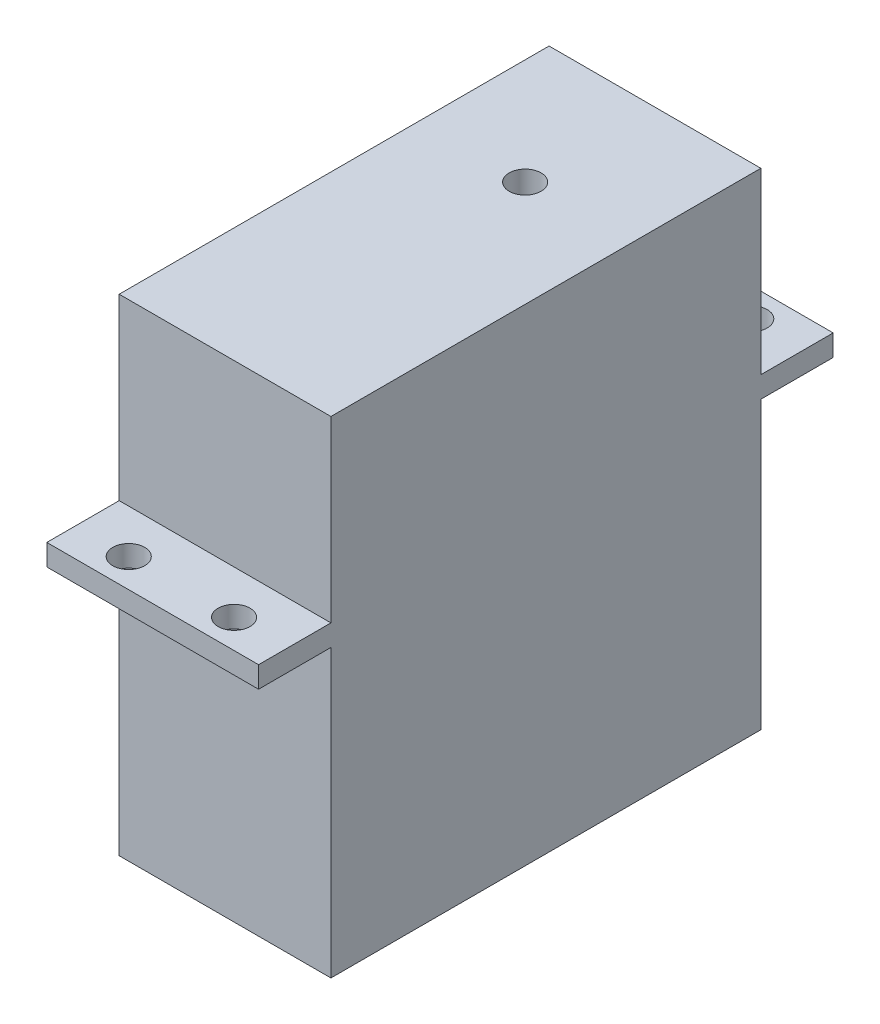
ISO-10303-21;
HEADER;
FILE_DESCRIPTION(('STEP AP214'),'2;1');
FILE_NAME('part.step','',(''),(''),'','','');
FILE_SCHEMA(('AUTOMOTIVE_DESIGN { 1 0 10303 214 1 1 1 1 }'));
ENDSEC;
DATA;
#1=APPLICATION_CONTEXT('core data for automotive mechanical design processes');
#2=APPLICATION_PROTOCOL_DEFINITION('international standard','automotive_design',2000,#1);
#3=PRODUCT_CONTEXT('',#1,'mechanical');
#4=PRODUCT('Part','Part','',(#3));
#5=PRODUCT_RELATED_PRODUCT_CATEGORY('part','',(#4));
#6=PRODUCT_DEFINITION_FORMATION('','',#4);
#7=PRODUCT_DEFINITION_CONTEXT('part definition',#1,'design');
#8=PRODUCT_DEFINITION('design','',#6,#7);
#9=PRODUCT_DEFINITION_SHAPE('','',#8);
#10=(LENGTH_UNIT() NAMED_UNIT(*) SI_UNIT(.MILLI.,.METRE.));
#11=(NAMED_UNIT(*) PLANE_ANGLE_UNIT() SI_UNIT($,.RADIAN.));
#12=(NAMED_UNIT(*) SI_UNIT($,.STERADIAN.) SOLID_ANGLE_UNIT());
#13=UNCERTAINTY_MEASURE_WITH_UNIT(LENGTH_MEASURE(1.E-05),#10,'distance_accuracy_value','');
#14=(GEOMETRIC_REPRESENTATION_CONTEXT(3) GLOBAL_UNCERTAINTY_ASSIGNED_CONTEXT((#13)) GLOBAL_UNIT_ASSIGNED_CONTEXT((#10,
#11,#12)) REPRESENTATION_CONTEXT('',''));
#15=CARTESIAN_POINT('',(0.,0.,0.));
#16=DIRECTION('',(0.,0.,1.));
#17=DIRECTION('',(1.,0.,0.));
#18=AXIS2_PLACEMENT_3D('',#15,#16,#17);
#19=CARTESIAN_POINT('',(-9.95,45.7,-20.2));
#20=DIRECTION('',(0.,0.,1.));
#21=DIRECTION('',(1.,0.,0.));
#22=AXIS2_PLACEMENT_3D('',#19,#20,#21);
#23=PLANE('',#22);
#24=DIRECTION('',(-1.,0.,0.));
#25=VECTOR('',#24,1.);
#26=CARTESIAN_POINT('',(-9.95,26.9,-20.2));
#27=LINE('',#26,#25);
#28=CARTESIAN_POINT('',(9.95,26.9,-20.2));
#29=VERTEX_POINT('',#28);
#30=CARTESIAN_POINT('',(-9.95,26.9,-20.2));
#31=VERTEX_POINT('',#30);
#32=EDGE_CURVE('E51',#29,#31,#27,.T.);
#33=ORIENTED_EDGE('',*,*,#32,.F.);
#34=DIRECTION('',(0.,-1.,0.));
#35=VECTOR('',#34,1.);
#36=CARTESIAN_POINT('',(9.95,45.7,-20.2));
#37=LINE('',#36,#35);
#38=CARTESIAN_POINT('',(9.95,0.,-20.2));
#39=VERTEX_POINT('',#38);
#40=EDGE_CURVE('E185',#29,#39,#37,.T.);
#41=ORIENTED_EDGE('',*,*,#40,.T.);
#42=DIRECTION('',(-1.,0.,0.));
#43=VECTOR('',#42,1.);
#44=CARTESIAN_POINT('',(-9.95,0.,-20.2));
#45=LINE('',#44,#43);
#46=CARTESIAN_POINT('',(-9.95,0.,-20.2));
#47=VERTEX_POINT('',#46);
#48=EDGE_CURVE('E172',#39,#47,#45,.T.);
#49=ORIENTED_EDGE('',*,*,#48,.T.);
#50=DIRECTION('',(0.,-1.,0.));
#51=VECTOR('',#50,1.);
#52=CARTESIAN_POINT('',(-9.95,45.7,-20.2));
#53=LINE('',#52,#51);
#54=EDGE_CURVE('E56',#31,#47,#53,.T.);
#55=ORIENTED_EDGE('',*,*,#54,.F.);
#56=EDGE_LOOP('',(#33,#41,#49,#55));
#57=FACE_BOUND('',#56,.T.);
#58=ADVANCED_FACE('F34',(#57),#23,.F.);
#59=DIRECTION('',(1.,0.,0.));
#60=VECTOR('',#59,1.);
#61=CARTESIAN_POINT('',(-9.95,28.9,-20.2));
#62=LINE('',#61,#60);
#63=CARTESIAN_POINT('',(-9.95,28.9,-20.2));
#64=VERTEX_POINT('',#63);
#65=CARTESIAN_POINT('',(9.94999999999999,28.9,-20.2));
#66=VERTEX_POINT('',#65);
#67=EDGE_CURVE('E149',#64,#66,#62,.T.);
#68=ORIENTED_EDGE('',*,*,#67,.F.);
#69=CARTESIAN_POINT('',(-9.95,45.7,-20.2));
#70=VERTEX_POINT('',#69);
#71=EDGE_CURVE('E183',#70,#64,#53,.T.);
#72=ORIENTED_EDGE('',*,*,#71,.F.);
#73=DIRECTION('',(-1.,0.,0.));
#74=VECTOR('',#73,1.);
#75=CARTESIAN_POINT('',(-9.95,45.7,-20.2));
#76=LINE('',#75,#74);
#77=CARTESIAN_POINT('',(9.95,45.7,-20.2));
#78=VERTEX_POINT('',#77);
#79=EDGE_CURVE('E162',#78,#70,#76,.T.);
#80=ORIENTED_EDGE('',*,*,#79,.F.);
#81=EDGE_CURVE('E186',#78,#66,#37,.T.);
#82=ORIENTED_EDGE('',*,*,#81,.T.);
#83=EDGE_LOOP('',(#68,#72,#80,#82));
#84=FACE_BOUND('',#83,.T.);
#85=ADVANCED_FACE('F250',(#84),#23,.F.);
#86=CARTESIAN_POINT('',(-9.94999999999999,45.7,20.2));
#87=DIRECTION('',(0.,0.,-1.));
#88=DIRECTION('',(-1.,0.,0.));
#89=AXIS2_PLACEMENT_3D('',#86,#87,#88);
#90=PLANE('',#89);
#91=DIRECTION('',(1.,0.,0.));
#92=VECTOR('',#91,1.);
#93=CARTESIAN_POINT('',(-9.94999999999999,26.9,20.2));
#94=LINE('',#93,#92);
#95=CARTESIAN_POINT('',(-9.94999999999999,26.9,20.2));
#96=VERTEX_POINT('',#95);
#97=CARTESIAN_POINT('',(9.95,26.9,20.2));
#98=VERTEX_POINT('',#97);
#99=EDGE_CURVE('E11',#96,#98,#94,.T.);
#100=ORIENTED_EDGE('',*,*,#99,.F.);
#101=DIRECTION('',(0.,-1.,0.));
#102=VECTOR('',#101,1.);
#103=CARTESIAN_POINT('',(-9.94999999999999,45.7,20.2));
#104=LINE('',#103,#102);
#105=CARTESIAN_POINT('',(-9.94999999999999,0.,20.2));
#106=VERTEX_POINT('',#105);
#107=EDGE_CURVE('E148',#96,#106,#104,.T.);
#108=ORIENTED_EDGE('',*,*,#107,.T.);
#109=DIRECTION('',(1.,0.,0.));
#110=VECTOR('',#109,1.);
#111=CARTESIAN_POINT('',(-9.94999999999999,0.,20.2));
#112=LINE('',#111,#110);
#113=CARTESIAN_POINT('',(9.95,0.,20.2));
#114=VERTEX_POINT('',#113);
#115=EDGE_CURVE('E163',#106,#114,#112,.T.);
#116=ORIENTED_EDGE('',*,*,#115,.T.);
#117=DIRECTION('',(0.,-1.,0.));
#118=VECTOR('',#117,1.);
#119=CARTESIAN_POINT('',(9.95,45.7,20.2));
#120=LINE('',#119,#118);
#121=EDGE_CURVE('E169',#98,#114,#120,.T.);
#122=ORIENTED_EDGE('',*,*,#121,.F.);
#123=EDGE_LOOP('',(#100,#108,#116,#122));
#124=FACE_BOUND('',#123,.T.);
#125=ADVANCED_FACE('F280',(#124),#90,.F.);
#126=DIRECTION('',(-1.,0.,0.));
#127=VECTOR('',#126,1.);
#128=CARTESIAN_POINT('',(-9.94999999999999,28.9,20.2));
#129=LINE('',#128,#127);
#130=CARTESIAN_POINT('',(9.95,28.9,20.2));
#131=VERTEX_POINT('',#130);
#132=CARTESIAN_POINT('',(-9.94999999999999,28.9,20.2));
#133=VERTEX_POINT('',#132);
#134=EDGE_CURVE('E43',#131,#133,#129,.T.);
#135=ORIENTED_EDGE('',*,*,#134,.F.);
#136=CARTESIAN_POINT('',(9.95,45.7,20.2));
#137=VERTEX_POINT('',#136);
#138=EDGE_CURVE('E178',#137,#131,#120,.T.);
#139=ORIENTED_EDGE('',*,*,#138,.F.);
#140=DIRECTION('',(1.,0.,0.));
#141=VECTOR('',#140,1.);
#142=CARTESIAN_POINT('',(-9.94999999999999,45.7,20.2));
#143=LINE('',#142,#141);
#144=CARTESIAN_POINT('',(-9.94999999999999,45.7,20.2));
#145=VERTEX_POINT('',#144);
#146=EDGE_CURVE('E167',#145,#137,#143,.T.);
#147=ORIENTED_EDGE('',*,*,#146,.F.);
#148=EDGE_CURVE('E181',#145,#133,#104,.T.);
#149=ORIENTED_EDGE('',*,*,#148,.T.);
#150=EDGE_LOOP('',(#135,#139,#147,#149));
#151=FACE_BOUND('',#150,.T.);
#152=ADVANCED_FACE('F257',(#151),#90,.F.);
#153=CARTESIAN_POINT('',(9.95,45.7,-20.2));
#154=DIRECTION('',(-1.,0.,0.));
#155=DIRECTION('',(0.,0.,1.));
#156=AXIS2_PLACEMENT_3D('',#153,#154,#155);
#157=PLANE('',#156);
#158=DIRECTION('',(0.,0.,-1.));
#159=VECTOR('',#158,1.);
#160=CARTESIAN_POINT('',(9.94999999999999,28.9,27.));
#161=LINE('',#160,#159);
#162=CARTESIAN_POINT('',(9.94999999999999,28.9,-27.));
#163=VERTEX_POINT('',#162);
#164=EDGE_CURVE('E226',#66,#163,#161,.T.);
#165=ORIENTED_EDGE('',*,*,#164,.F.);
#166=ORIENTED_EDGE('',*,*,#81,.F.);
#167=DIRECTION('',(0.,0.,-1.));
#168=VECTOR('',#167,1.);
#169=CARTESIAN_POINT('',(9.95,45.7,-20.2));
#170=LINE('',#169,#168);
#171=EDGE_CURVE('E159',#137,#78,#170,.T.);
#172=ORIENTED_EDGE('',*,*,#171,.F.);
#173=ORIENTED_EDGE('',*,*,#138,.T.);
#174=CARTESIAN_POINT('',(9.94999999999999,28.9,27.));
#175=VERTEX_POINT('',#174);
#176=EDGE_CURVE('E227',#175,#131,#161,.T.);
#177=ORIENTED_EDGE('',*,*,#176,.F.);
#178=DIRECTION('',(0.,1.,0.));
#179=VECTOR('',#178,1.);
#180=CARTESIAN_POINT('',(9.94999999999999,28.9,27.));
#181=LINE('',#180,#179);
#182=CARTESIAN_POINT('',(9.94999999999999,26.9,27.));
#183=VERTEX_POINT('',#182);
#184=EDGE_CURVE('E132',#183,#175,#181,.T.);
#185=ORIENTED_EDGE('',*,*,#184,.F.);
#186=DIRECTION('',(0.,0.,-1.));
#187=VECTOR('',#186,1.);
#188=CARTESIAN_POINT('',(9.94999999999999,26.9,27.));
#189=LINE('',#188,#187);
#190=EDGE_CURVE('E129',#183,#98,#189,.T.);
#191=ORIENTED_EDGE('',*,*,#190,.T.);
#192=ORIENTED_EDGE('',*,*,#121,.T.);
#193=DIRECTION('',(0.,0.,-1.));
#194=VECTOR('',#193,1.);
#195=CARTESIAN_POINT('',(9.95,0.,-20.2));
#196=LINE('',#195,#194);
#197=EDGE_CURVE('E158',#114,#39,#196,.T.);
#198=ORIENTED_EDGE('',*,*,#197,.T.);
#199=ORIENTED_EDGE('',*,*,#40,.F.);
#200=CARTESIAN_POINT('',(9.94999999999999,26.9,-27.));
#201=VERTEX_POINT('',#200);
#202=EDGE_CURVE('E229',#29,#201,#189,.T.);
#203=ORIENTED_EDGE('',*,*,#202,.T.);
#204=DIRECTION('',(0.,1.,0.));
#205=VECTOR('',#204,1.);
#206=CARTESIAN_POINT('',(9.94999999999999,28.9,-27.));
#207=LINE('',#206,#205);
#208=EDGE_CURVE('E220',#201,#163,#207,.T.);
#209=ORIENTED_EDGE('',*,*,#208,.T.);
#210=EDGE_LOOP('',(#165,#166,#172,#173,#177,#185,#191,#192,#198,#199,#203,#209));
#211=FACE_BOUND('',#210,.T.);
#212=ADVANCED_FACE('F36',(#211),#157,.F.);
#213=CARTESIAN_POINT('',(-9.95,45.7,-20.2));
#214=DIRECTION('',(1.,0.,0.));
#215=DIRECTION('',(0.,0.,-1.));
#216=AXIS2_PLACEMENT_3D('',#213,#214,#215);
#217=PLANE('',#216);
#218=ORIENTED_EDGE('',*,*,#71,.T.);
#219=DIRECTION('',(0.,0.,-1.));
#220=VECTOR('',#219,1.);
#221=CARTESIAN_POINT('',(-9.94999999999999,28.9,27.));
#222=LINE('',#221,#220);
#223=CARTESIAN_POINT('',(-9.94999999999999,28.9,-27.));
#224=VERTEX_POINT('',#223);
#225=EDGE_CURVE('E214',#64,#224,#222,.T.);
#226=ORIENTED_EDGE('',*,*,#225,.T.);
#227=DIRECTION('',(0.,-1.,0.));
#228=VECTOR('',#227,1.);
#229=CARTESIAN_POINT('',(-9.94999999999999,28.9,-27.));
#230=LINE('',#229,#228);
#231=CARTESIAN_POINT('',(-9.94999999999999,26.9,-27.));
#232=VERTEX_POINT('',#231);
#233=EDGE_CURVE('E209',#224,#232,#230,.T.);
#234=ORIENTED_EDGE('',*,*,#233,.T.);
#235=DIRECTION('',(0.,0.,-1.));
#236=VECTOR('',#235,1.);
#237=CARTESIAN_POINT('',(-9.94999999999999,26.9,27.));
#238=LINE('',#237,#236);
#239=EDGE_CURVE('E150',#31,#232,#238,.T.);
#240=ORIENTED_EDGE('',*,*,#239,.F.);
#241=ORIENTED_EDGE('',*,*,#54,.T.);
#242=DIRECTION('',(0.,0.,1.));
#243=VECTOR('',#242,1.);
#244=CARTESIAN_POINT('',(-9.95,0.,-20.2));
#245=LINE('',#244,#243);
#246=EDGE_CURVE('E174',#47,#106,#245,.T.);
#247=ORIENTED_EDGE('',*,*,#246,.T.);
#248=ORIENTED_EDGE('',*,*,#107,.F.);
#249=CARTESIAN_POINT('',(-9.94999999999999,26.9,27.));
#250=VERTEX_POINT('',#249);
#251=EDGE_CURVE('E127',#250,#96,#238,.T.);
#252=ORIENTED_EDGE('',*,*,#251,.F.);
#253=DIRECTION('',(0.,-1.,0.));
#254=VECTOR('',#253,1.);
#255=CARTESIAN_POINT('',(-9.94999999999999,28.9,27.));
#256=LINE('',#255,#254);
#257=CARTESIAN_POINT('',(-9.94999999999999,28.9,27.));
#258=VERTEX_POINT('',#257);
#259=EDGE_CURVE('E133',#258,#250,#256,.T.);
#260=ORIENTED_EDGE('',*,*,#259,.F.);
#261=EDGE_CURVE('E225',#258,#133,#222,.T.);
#262=ORIENTED_EDGE('',*,*,#261,.T.);
#263=ORIENTED_EDGE('',*,*,#148,.F.);
#264=DIRECTION('',(0.,0.,1.));
#265=VECTOR('',#264,1.);
#266=CARTESIAN_POINT('',(-9.95,45.7,-20.2));
#267=LINE('',#266,#265);
#268=EDGE_CURVE('E165',#70,#145,#267,.T.);
#269=ORIENTED_EDGE('',*,*,#268,.F.);
#270=EDGE_LOOP('',(#218,#226,#234,#240,#241,#247,#248,#252,#260,#262,#263,#269));
#271=FACE_BOUND('',#270,.T.);
#272=ADVANCED_FACE('F146',(#271),#217,.F.);
#273=CARTESIAN_POINT('',(0.,45.7,0.));
#274=DIRECTION('',(0.,1.,0.));
#275=DIRECTION('',(0.,0.,1.));
#276=AXIS2_PLACEMENT_3D('',#273,#274,#275);
#277=PLANE('',#276);
#278=CARTESIAN_POINT('',(0.,45.7,-8.00000000000001));
#279=DIRECTION('',(0.,1.,0.));
#280=DIRECTION('',(0.,0.,1.));
#281=AXIS2_PLACEMENT_3D('',#278,#279,#280);
#282=CIRCLE('',#281,1.5);
#283=CARTESIAN_POINT('',(0.,45.7,-6.50000000000001));
#284=VERTEX_POINT('',#283);
#285=EDGE_CURVE('E195',#284,#284,#282,.T.);
#286=ORIENTED_EDGE('',*,*,#285,.F.);
#287=EDGE_LOOP('',(#286));
#288=FACE_BOUND('',#287,.T.);
#289=ORIENTED_EDGE('',*,*,#171,.T.);
#290=ORIENTED_EDGE('',*,*,#79,.T.);
#291=ORIENTED_EDGE('',*,*,#268,.T.);
#292=ORIENTED_EDGE('',*,*,#146,.T.);
#293=EDGE_LOOP('',(#289,#290,#291,#292));
#294=FACE_BOUND('',#293,.T.);
#295=ADVANCED_FACE('F254',(#288,#294),#277,.T.);
#296=CARTESIAN_POINT('',(0.,0.,0.));
#297=DIRECTION('',(0.,1.,0.));
#298=DIRECTION('',(0.,0.,1.));
#299=AXIS2_PLACEMENT_3D('',#296,#297,#298);
#300=PLANE('',#299);
#301=ORIENTED_EDGE('',*,*,#197,.F.);
#302=ORIENTED_EDGE('',*,*,#115,.F.);
#303=ORIENTED_EDGE('',*,*,#246,.F.);
#304=ORIENTED_EDGE('',*,*,#48,.F.);
#305=EDGE_LOOP('',(#301,#302,#303,#304));
#306=FACE_BOUND('',#305,.T.);
#307=ADVANCED_FACE('F269',(#306),#300,.F.);
#308=CARTESIAN_POINT('',(0.,0.,27.));
#309=DIRECTION('',(0.,0.,1.));
#310=DIRECTION('',(1.,0.,0.));
#311=AXIS2_PLACEMENT_3D('',#308,#309,#310);
#312=PLANE('',#311);
#313=ORIENTED_EDGE('',*,*,#259,.T.);
#314=DIRECTION('',(1.,0.,0.));
#315=VECTOR('',#314,1.);
#316=CARTESIAN_POINT('',(-9.94999999999999,26.9,27.));
#317=LINE('',#316,#315);
#318=EDGE_CURVE('E123',#250,#183,#317,.T.);
#319=ORIENTED_EDGE('',*,*,#318,.T.);
#320=ORIENTED_EDGE('',*,*,#184,.T.);
#321=DIRECTION('',(-1.,0.,0.));
#322=VECTOR('',#321,1.);
#323=CARTESIAN_POINT('',(-9.94999999999999,28.9,27.));
#324=LINE('',#323,#322);
#325=EDGE_CURVE('E138',#175,#258,#324,.T.);
#326=ORIENTED_EDGE('',*,*,#325,.T.);
#327=EDGE_LOOP('',(#313,#319,#320,#326));
#328=FACE_BOUND('',#327,.T.);
#329=ADVANCED_FACE('F136',(#328),#312,.T.);
#330=CARTESIAN_POINT('',(-9.94999999999999,28.9,27.));
#331=DIRECTION('',(0.,-1.,0.));
#332=DIRECTION('',(0.,0.,-1.));
#333=AXIS2_PLACEMENT_3D('',#330,#331,#332);
#334=PLANE('',#333);
#335=CARTESIAN_POINT('',(-4.95,28.9,24.3));
#336=DIRECTION('',(0.,1.,0.));
#337=DIRECTION('',(0.,0.,1.));
#338=AXIS2_PLACEMENT_3D('',#335,#336,#337);
#339=CIRCLE('',#338,1.5);
#340=CARTESIAN_POINT('',(-4.95,28.9,25.8));
#341=VERTEX_POINT('',#340);
#342=EDGE_CURVE('E388',#341,#341,#339,.T.);
#343=ORIENTED_EDGE('',*,*,#342,.F.);
#344=EDGE_LOOP('',(#343));
#345=FACE_BOUND('',#344,.T.);
#346=CARTESIAN_POINT('',(4.95,28.9,24.3));
#347=DIRECTION('',(0.,1.,0.));
#348=DIRECTION('',(0.,0.,1.));
#349=AXIS2_PLACEMENT_3D('',#346,#347,#348);
#350=CIRCLE('',#349,1.5);
#351=CARTESIAN_POINT('',(4.95,28.9,25.8));
#352=VERTEX_POINT('',#351);
#353=EDGE_CURVE('E391',#352,#352,#350,.T.);
#354=ORIENTED_EDGE('',*,*,#353,.F.);
#355=EDGE_LOOP('',(#354));
#356=FACE_BOUND('',#355,.T.);
#357=ORIENTED_EDGE('',*,*,#176,.T.);
#358=ORIENTED_EDGE('',*,*,#134,.T.);
#359=ORIENTED_EDGE('',*,*,#261,.F.);
#360=ORIENTED_EDGE('',*,*,#325,.F.);
#361=EDGE_LOOP('',(#357,#358,#359,#360));
#362=FACE_BOUND('',#361,.T.);
#363=ADVANCED_FACE('F258',(#345,#356,#362),#334,.F.);
#364=CARTESIAN_POINT('',(-9.94999999999999,26.9,27.));
#365=DIRECTION('',(0.,1.,0.));
#366=DIRECTION('',(0.,0.,1.));
#367=AXIS2_PLACEMENT_3D('',#364,#365,#366);
#368=PLANE('',#367);
#369=CARTESIAN_POINT('',(-4.95,26.9,24.3));
#370=DIRECTION('',(0.,1.,0.));
#371=DIRECTION('',(0.,0.,1.));
#372=AXIS2_PLACEMENT_3D('',#369,#370,#371);
#373=CIRCLE('',#372,1.5);
#374=CARTESIAN_POINT('',(-4.95,26.9,25.8));
#375=VERTEX_POINT('',#374);
#376=EDGE_CURVE('E38',#375,#375,#373,.T.);
#377=ORIENTED_EDGE('',*,*,#376,.T.);
#378=EDGE_LOOP('',(#377));
#379=FACE_BOUND('',#378,.T.);
#380=CARTESIAN_POINT('',(4.95,26.9,24.3));
#381=DIRECTION('',(0.,1.,0.));
#382=DIRECTION('',(0.,0.,1.));
#383=AXIS2_PLACEMENT_3D('',#380,#381,#382);
#384=CIRCLE('',#383,1.5);
#385=CARTESIAN_POINT('',(4.95,26.9,25.8));
#386=VERTEX_POINT('',#385);
#387=EDGE_CURVE('E189',#386,#386,#384,.T.);
#388=ORIENTED_EDGE('',*,*,#387,.T.);
#389=EDGE_LOOP('',(#388));
#390=FACE_BOUND('',#389,.T.);
#391=ORIENTED_EDGE('',*,*,#251,.T.);
#392=ORIENTED_EDGE('',*,*,#99,.T.);
#393=ORIENTED_EDGE('',*,*,#190,.F.);
#394=ORIENTED_EDGE('',*,*,#318,.F.);
#395=EDGE_LOOP('',(#391,#392,#393,#394));
#396=FACE_BOUND('',#395,.T.);
#397=ADVANCED_FACE('F125',(#379,#390,#396),#368,.F.);
#398=CARTESIAN_POINT('',(4.95,26.9,-24.3));
#399=DIRECTION('',(0.,1.,0.));
#400=DIRECTION('',(0.,0.,1.));
#401=AXIS2_PLACEMENT_3D('',#398,#399,#400);
#402=CIRCLE('',#401,1.5);
#403=CARTESIAN_POINT('',(4.95,26.9,-22.8));
#404=VERTEX_POINT('',#403);
#405=EDGE_CURVE('E191',#404,#404,#402,.T.);
#406=ORIENTED_EDGE('',*,*,#405,.T.);
#407=EDGE_LOOP('',(#406));
#408=FACE_BOUND('',#407,.T.);
#409=CARTESIAN_POINT('',(-4.95,26.9,-24.3));
#410=DIRECTION('',(0.,1.,0.));
#411=DIRECTION('',(0.,0.,1.));
#412=AXIS2_PLACEMENT_3D('',#409,#410,#411);
#413=CIRCLE('',#412,1.5);
#414=CARTESIAN_POINT('',(-4.95,26.9,-22.8));
#415=VERTEX_POINT('',#414);
#416=EDGE_CURVE('E197',#415,#415,#413,.T.);
#417=ORIENTED_EDGE('',*,*,#416,.T.);
#418=EDGE_LOOP('',(#417));
#419=FACE_BOUND('',#418,.T.);
#420=ORIENTED_EDGE('',*,*,#202,.F.);
#421=ORIENTED_EDGE('',*,*,#32,.T.);
#422=ORIENTED_EDGE('',*,*,#239,.T.);
#423=DIRECTION('',(1.,0.,0.));
#424=VECTOR('',#423,1.);
#425=CARTESIAN_POINT('',(-9.94999999999999,26.9,-27.));
#426=LINE('',#425,#424);
#427=EDGE_CURVE('E217',#232,#201,#426,.T.);
#428=ORIENTED_EDGE('',*,*,#427,.T.);
#429=EDGE_LOOP('',(#420,#421,#422,#428));
#430=FACE_BOUND('',#429,.T.);
#431=ADVANCED_FACE('F266',(#408,#419,#430),#368,.F.);
#432=CARTESIAN_POINT('',(4.95,28.9,-24.3));
#433=DIRECTION('',(0.,1.,0.));
#434=DIRECTION('',(0.,0.,1.));
#435=AXIS2_PLACEMENT_3D('',#432,#433,#434);
#436=CIRCLE('',#435,1.5);
#437=CARTESIAN_POINT('',(4.95,28.9,-22.8));
#438=VERTEX_POINT('',#437);
#439=EDGE_CURVE('E390',#438,#438,#436,.T.);
#440=ORIENTED_EDGE('',*,*,#439,.F.);
#441=EDGE_LOOP('',(#440));
#442=FACE_BOUND('',#441,.T.);
#443=CARTESIAN_POINT('',(-4.95,28.9,-24.3));
#444=DIRECTION('',(0.,1.,0.));
#445=DIRECTION('',(0.,0.,1.));
#446=AXIS2_PLACEMENT_3D('',#443,#444,#445);
#447=CIRCLE('',#446,1.5);
#448=CARTESIAN_POINT('',(-4.95,28.9,-22.8));
#449=VERTEX_POINT('',#448);
#450=EDGE_CURVE('E202',#449,#449,#447,.T.);
#451=ORIENTED_EDGE('',*,*,#450,.F.);
#452=EDGE_LOOP('',(#451));
#453=FACE_BOUND('',#452,.T.);
#454=ORIENTED_EDGE('',*,*,#225,.F.);
#455=ORIENTED_EDGE('',*,*,#67,.T.);
#456=ORIENTED_EDGE('',*,*,#164,.T.);
#457=DIRECTION('',(-1.,0.,0.));
#458=VECTOR('',#457,1.);
#459=CARTESIAN_POINT('',(-9.94999999999999,28.9,-27.));
#460=LINE('',#459,#458);
#461=EDGE_CURVE('E142',#163,#224,#460,.T.);
#462=ORIENTED_EDGE('',*,*,#461,.T.);
#463=EDGE_LOOP('',(#454,#455,#456,#462));
#464=FACE_BOUND('',#463,.T.);
#465=ADVANCED_FACE('F235',(#442,#453,#464),#334,.F.);
#466=CARTESIAN_POINT('',(0.,0.,-27.));
#467=DIRECTION('',(0.,0.,1.));
#468=DIRECTION('',(1.,0.,0.));
#469=AXIS2_PLACEMENT_3D('',#466,#467,#468);
#470=PLANE('',#469);
#471=ORIENTED_EDGE('',*,*,#233,.F.);
#472=ORIENTED_EDGE('',*,*,#461,.F.);
#473=ORIENTED_EDGE('',*,*,#208,.F.);
#474=ORIENTED_EDGE('',*,*,#427,.F.);
#475=EDGE_LOOP('',(#471,#472,#473,#474));
#476=FACE_BOUND('',#475,.T.);
#477=ADVANCED_FACE('F244',(#476),#470,.F.);
#478=CARTESIAN_POINT('',(0.,42.7,-8.00000000000001));
#479=DIRECTION('',(0.,1.,0.));
#480=DIRECTION('',(0.,0.,1.));
#481=AXIS2_PLACEMENT_3D('',#478,#479,#480);
#482=CYLINDRICAL_SURFACE('',#481,1.5);
#483=CARTESIAN_POINT('',(0.,42.7,-8.00000000000001));
#484=DIRECTION('',(0.,1.,0.));
#485=DIRECTION('',(0.,0.,1.));
#486=AXIS2_PLACEMENT_3D('',#483,#484,#485);
#487=CIRCLE('',#486,1.5);
#488=CARTESIAN_POINT('',(0.,42.7,-6.50000000000001));
#489=VERTEX_POINT('',#488);
#490=EDGE_CURVE('E206',#489,#489,#487,.T.);
#491=ORIENTED_EDGE('',*,*,#490,.F.);
#492=EDGE_LOOP('',(#491));
#493=FACE_BOUND('',#492,.T.);
#494=ORIENTED_EDGE('',*,*,#285,.T.);
#495=EDGE_LOOP('',(#494));
#496=FACE_BOUND('',#495,.T.);
#497=ADVANCED_FACE('F312',(#493,#496),#482,.F.);
#498=CARTESIAN_POINT('',(0.,42.7,-8.00000000000001));
#499=DIRECTION('',(0.,1.,0.));
#500=DIRECTION('',(0.,0.,1.));
#501=AXIS2_PLACEMENT_3D('',#498,#499,#500);
#502=PLANE('',#501);
#503=ORIENTED_EDGE('',*,*,#490,.T.);
#504=EDGE_LOOP('',(#503));
#505=FACE_BOUND('',#504,.T.);
#506=ADVANCED_FACE('F302',(#505),#502,.T.);
#507=CARTESIAN_POINT('',(-4.95,0.,-24.3));
#508=DIRECTION('',(0.,1.,0.));
#509=DIRECTION('',(0.,0.,1.));
#510=AXIS2_PLACEMENT_3D('',#507,#508,#509);
#511=CYLINDRICAL_SURFACE('',#510,1.5);
#512=ORIENTED_EDGE('',*,*,#450,.T.);
#513=EDGE_LOOP('',(#512));
#514=FACE_BOUND('',#513,.T.);
#515=ORIENTED_EDGE('',*,*,#416,.F.);
#516=EDGE_LOOP('',(#515));
#517=FACE_BOUND('',#516,.T.);
#518=ADVANCED_FACE('F299',(#514,#517),#511,.F.);
#519=CARTESIAN_POINT('',(4.95,0.,-24.3));
#520=DIRECTION('',(0.,1.,0.));
#521=DIRECTION('',(0.,0.,1.));
#522=AXIS2_PLACEMENT_3D('',#519,#520,#521);
#523=CYLINDRICAL_SURFACE('',#522,1.5);
#524=ORIENTED_EDGE('',*,*,#439,.T.);
#525=EDGE_LOOP('',(#524));
#526=FACE_BOUND('',#525,.T.);
#527=ORIENTED_EDGE('',*,*,#405,.F.);
#528=EDGE_LOOP('',(#527));
#529=FACE_BOUND('',#528,.T.);
#530=ADVANCED_FACE('F301',(#526,#529),#523,.F.);
#531=CARTESIAN_POINT('',(4.95,0.,24.3));
#532=DIRECTION('',(0.,1.,0.));
#533=DIRECTION('',(0.,0.,1.));
#534=AXIS2_PLACEMENT_3D('',#531,#532,#533);
#535=CYLINDRICAL_SURFACE('',#534,1.5);
#536=ORIENTED_EDGE('',*,*,#353,.T.);
#537=EDGE_LOOP('',(#536));
#538=FACE_BOUND('',#537,.T.);
#539=ORIENTED_EDGE('',*,*,#387,.F.);
#540=EDGE_LOOP('',(#539));
#541=FACE_BOUND('',#540,.T.);
#542=ADVANCED_FACE('F309',(#538,#541),#535,.F.);
#543=CARTESIAN_POINT('',(-4.95,0.,24.3));
#544=DIRECTION('',(0.,1.,0.));
#545=DIRECTION('',(0.,0.,1.));
#546=AXIS2_PLACEMENT_3D('',#543,#544,#545);
#547=CYLINDRICAL_SURFACE('',#546,1.5);
#548=ORIENTED_EDGE('',*,*,#342,.T.);
#549=EDGE_LOOP('',(#548));
#550=FACE_BOUND('',#549,.T.);
#551=ORIENTED_EDGE('',*,*,#376,.F.);
#552=EDGE_LOOP('',(#551));
#553=FACE_BOUND('',#552,.T.);
#554=ADVANCED_FACE('F317',(#550,#553),#547,.F.);
#555=CLOSED_SHELL('',(#58,#85,#125,#152,#212,#272,#295,#307,#329,#363,#397,#431,#465,#477,#497,
#506,#518,#530,#542,#554));
#556=MANIFOLD_SOLID_BREP('B2',#555);
#557=ADVANCED_BREP_SHAPE_REPRESENTATION('',(#18,#556),#14);
#558=SHAPE_DEFINITION_REPRESENTATION(#9,#557);
ENDSEC;
END-ISO-10303-21;
